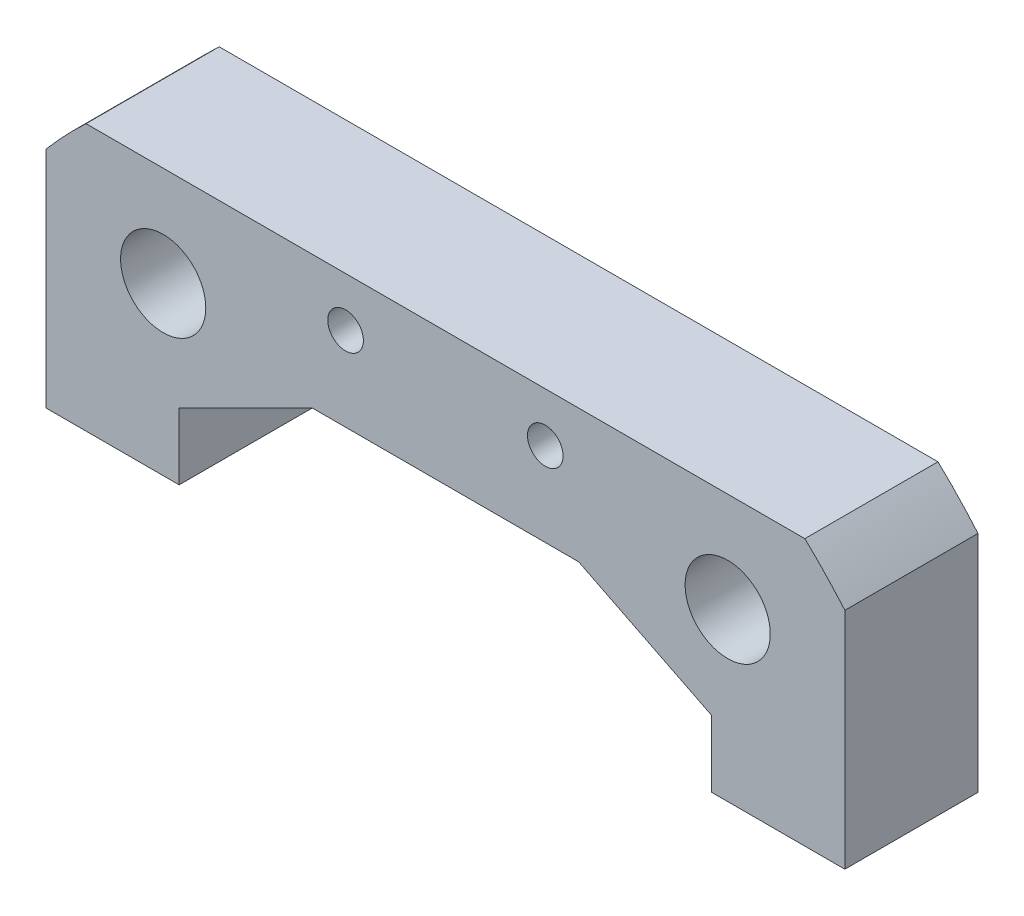
ISO-10303-21;
HEADER;
FILE_DESCRIPTION(('STEP AP214'),'2;1');
FILE_NAME('part.step','',(''),(''),'','','');
FILE_SCHEMA(('AUTOMOTIVE_DESIGN { 1 0 10303 214 1 1 1 1 }'));
ENDSEC;
DATA;
#1=APPLICATION_CONTEXT('core data for automotive mechanical design processes');
#2=APPLICATION_PROTOCOL_DEFINITION('international standard','automotive_design',2000,#1);
#3=PRODUCT_CONTEXT('',#1,'mechanical');
#4=PRODUCT('Part','Part','',(#3));
#5=PRODUCT_RELATED_PRODUCT_CATEGORY('part','',(#4));
#6=PRODUCT_DEFINITION_FORMATION('','',#4);
#7=PRODUCT_DEFINITION_CONTEXT('part definition',#1,'design');
#8=PRODUCT_DEFINITION('design','',#6,#7);
#9=PRODUCT_DEFINITION_SHAPE('','',#8);
#10=(LENGTH_UNIT() NAMED_UNIT(*) SI_UNIT(.MILLI.,.METRE.));
#11=(NAMED_UNIT(*) PLANE_ANGLE_UNIT() SI_UNIT($,.RADIAN.));
#12=(NAMED_UNIT(*) SI_UNIT($,.STERADIAN.) SOLID_ANGLE_UNIT());
#13=UNCERTAINTY_MEASURE_WITH_UNIT(LENGTH_MEASURE(1.E-05),#10,'distance_accuracy_value','');
#14=(GEOMETRIC_REPRESENTATION_CONTEXT(3) GLOBAL_UNCERTAINTY_ASSIGNED_CONTEXT((#13)) GLOBAL_UNIT_ASSIGNED_CONTEXT((#10,
#11,#12)) REPRESENTATION_CONTEXT('',''));
#15=CARTESIAN_POINT('',(0.,0.,0.));
#16=DIRECTION('',(0.,0.,1.));
#17=DIRECTION('',(1.,0.,0.));
#18=AXIS2_PLACEMENT_3D('',#15,#16,#17);
#19=CARTESIAN_POINT('',(0.,0.,12.7));
#20=DIRECTION('',(0.,0.,1.));
#21=DIRECTION('',(1.,0.,0.));
#22=AXIS2_PLACEMENT_3D('',#19,#20,#21);
#23=PLANE('',#22);
#24=CARTESIAN_POINT('',(0.,-36.449,12.7));
#25=DIRECTION('',(0.,0.,-1.));
#26=DIRECTION('',(1.,0.,0.));
#27=AXIS2_PLACEMENT_3D('',#24,#25,#26);
#28=CIRCLE('',#27,50.038);
#29=CARTESIAN_POINT('',(-38.1,-4.01149941811176,12.7));
#30=VERTEX_POINT('',#29);
#31=CARTESIAN_POINT('',(-34.282238010375,0.,12.7));
#32=VERTEX_POINT('',#31);
#33=EDGE_CURVE('E128',#30,#32,#28,.T.);
#34=ORIENTED_EDGE('',*,*,#33,.F.);
#35=DIRECTION('',(0.,-1.,0.));
#36=VECTOR('',#35,1.);
#37=CARTESIAN_POINT('',(-38.1,0.,12.7));
#38=LINE('',#37,#36);
#39=CARTESIAN_POINT('',(-38.1,-25.4,12.7));
#40=VERTEX_POINT('',#39);
#41=EDGE_CURVE('E202',#30,#40,#38,.T.);
#42=ORIENTED_EDGE('',*,*,#41,.T.);
#43=DIRECTION('',(1.,0.,0.));
#44=VECTOR('',#43,1.);
#45=CARTESIAN_POINT('',(-38.1,-25.4,12.7));
#46=LINE('',#45,#44);
#47=CARTESIAN_POINT('',(-25.4,-25.4,12.7));
#48=VERTEX_POINT('',#47);
#49=EDGE_CURVE('E198',#40,#48,#46,.T.);
#50=ORIENTED_EDGE('',*,*,#49,.T.);
#51=DIRECTION('',(0.,1.,0.));
#52=VECTOR('',#51,1.);
#53=CARTESIAN_POINT('',(-25.4,-25.4,12.7));
#54=LINE('',#53,#52);
#55=CARTESIAN_POINT('',(-25.4,-19.05,12.7));
#56=VERTEX_POINT('',#55);
#57=EDGE_CURVE('E178',#48,#56,#54,.T.);
#58=ORIENTED_EDGE('',*,*,#57,.T.);
#59=DIRECTION('',(0.894427190999916,0.447213595499958,0.));
#60=VECTOR('',#59,1.);
#61=CARTESIAN_POINT('',(-25.4,-19.05,12.7));
#62=LINE('',#61,#60);
#63=CARTESIAN_POINT('',(-12.7,-12.7,12.7));
#64=VERTEX_POINT('',#63);
#65=EDGE_CURVE('E197',#56,#64,#62,.T.);
#66=ORIENTED_EDGE('',*,*,#65,.T.);
#67=DIRECTION('',(1.,0.,0.));
#68=VECTOR('',#67,1.);
#69=CARTESIAN_POINT('',(-12.7,-12.7,12.7));
#70=LINE('',#69,#68);
#71=CARTESIAN_POINT('',(12.7,-12.7,12.7));
#72=VERTEX_POINT('',#71);
#73=EDGE_CURVE('E155',#64,#72,#70,.T.);
#74=ORIENTED_EDGE('',*,*,#73,.T.);
#75=DIRECTION('',(-0.894427190999916,0.447213595499958,0.));
#76=VECTOR('',#75,1.);
#77=CARTESIAN_POINT('',(25.4,-19.05,12.7));
#78=LINE('',#77,#76);
#79=CARTESIAN_POINT('',(25.4,-19.05,12.7));
#80=VERTEX_POINT('',#79);
#81=EDGE_CURVE('E218',#80,#72,#78,.T.);
#82=ORIENTED_EDGE('',*,*,#81,.F.);
#83=DIRECTION('',(0.,1.,0.));
#84=VECTOR('',#83,1.);
#85=CARTESIAN_POINT('',(25.4,-25.4,12.7));
#86=LINE('',#85,#84);
#87=CARTESIAN_POINT('',(25.4,-25.4,12.7));
#88=VERTEX_POINT('',#87);
#89=EDGE_CURVE('E232',#88,#80,#86,.T.);
#90=ORIENTED_EDGE('',*,*,#89,.F.);
#91=DIRECTION('',(-1.,0.,0.));
#92=VECTOR('',#91,1.);
#93=CARTESIAN_POINT('',(38.1,-25.4,12.7));
#94=LINE('',#93,#92);
#95=CARTESIAN_POINT('',(38.1,-25.4,12.7));
#96=VERTEX_POINT('',#95);
#97=EDGE_CURVE('E229',#96,#88,#94,.T.);
#98=ORIENTED_EDGE('',*,*,#97,.F.);
#99=DIRECTION('',(0.,-1.,0.));
#100=VECTOR('',#99,1.);
#101=CARTESIAN_POINT('',(38.1,0.,12.7));
#102=LINE('',#101,#100);
#103=CARTESIAN_POINT('',(38.1,-4.01149941811176,12.7));
#104=VERTEX_POINT('',#103);
#105=EDGE_CURVE('E215',#104,#96,#102,.T.);
#106=ORIENTED_EDGE('',*,*,#105,.F.);
#107=CARTESIAN_POINT('',(0.,-36.449,12.7));
#108=DIRECTION('',(0.,0.,-1.));
#109=DIRECTION('',(1.,0.,0.));
#110=AXIS2_PLACEMENT_3D('',#107,#108,#109);
#111=CIRCLE('',#110,50.038);
#112=CARTESIAN_POINT('',(34.282238010375,0.,12.7));
#113=VERTEX_POINT('',#112);
#114=EDGE_CURVE('E61',#113,#104,#111,.T.);
#115=ORIENTED_EDGE('',*,*,#114,.F.);
#116=DIRECTION('',(-1.,0.,0.));
#117=VECTOR('',#116,1.);
#118=CARTESIAN_POINT('',(0.,0.,12.7));
#119=LINE('',#118,#117);
#120=EDGE_CURVE('E165',#113,#32,#119,.T.);
#121=ORIENTED_EDGE('',*,*,#120,.T.);
#122=EDGE_LOOP('',(#34,#42,#50,#58,#66,#74,#82,#90,#98,#106,#115,#121));
#123=FACE_BOUND('',#122,.T.);
#124=CARTESIAN_POINT('',(9.525,-4.699,12.7));
#125=DIRECTION('',(0.,0.,1.));
#126=DIRECTION('',(1.,0.,0.));
#127=AXIS2_PLACEMENT_3D('',#124,#125,#126);
#128=CIRCLE('',#127,1.7);
#129=CARTESIAN_POINT('',(11.225,-4.699,12.7));
#130=VERTEX_POINT('',#129);
#131=EDGE_CURVE('E251',#130,#130,#128,.T.);
#132=ORIENTED_EDGE('',*,*,#131,.F.);
#133=EDGE_LOOP('',(#132));
#134=FACE_BOUND('',#133,.T.);
#135=CARTESIAN_POINT('',(-9.525,-4.699,12.7));
#136=DIRECTION('',(0.,0.,1.));
#137=DIRECTION('',(1.,0.,0.));
#138=AXIS2_PLACEMENT_3D('',#135,#136,#137);
#139=CIRCLE('',#138,1.6999966);
#140=CARTESIAN_POINT('',(-7.8250034,-4.699,12.7));
#141=VERTEX_POINT('',#140);
#142=EDGE_CURVE('E241',#141,#141,#139,.T.);
#143=ORIENTED_EDGE('',*,*,#142,.F.);
#144=EDGE_LOOP('',(#143));
#145=FACE_BOUND('',#144,.T.);
#146=CARTESIAN_POINT('',(-26.924,-9.525,12.7));
#147=DIRECTION('',(0.,0.,1.));
#148=DIRECTION('',(1.,0.,0.));
#149=AXIS2_PLACEMENT_3D('',#146,#147,#148);
#150=CIRCLE('',#149,4.064);
#151=CARTESIAN_POINT('',(-22.86,-9.525,12.7));
#152=VERTEX_POINT('',#151);
#153=EDGE_CURVE('E147',#152,#152,#150,.T.);
#154=ORIENTED_EDGE('',*,*,#153,.F.);
#155=EDGE_LOOP('',(#154));
#156=FACE_BOUND('',#155,.T.);
#157=CARTESIAN_POINT('',(26.924,-9.525,12.7));
#158=DIRECTION('',(0.,0.,-1.));
#159=DIRECTION('',(-1.,0.,0.));
#160=AXIS2_PLACEMENT_3D('',#157,#158,#159);
#161=CIRCLE('',#160,4.064);
#162=CARTESIAN_POINT('',(22.86,-9.525,12.7));
#163=VERTEX_POINT('',#162);
#164=EDGE_CURVE('E227',#163,#163,#161,.T.);
#165=ORIENTED_EDGE('',*,*,#164,.T.);
#166=EDGE_LOOP('',(#165));
#167=FACE_BOUND('',#166,.T.);
#168=ADVANCED_FACE('F38',(#123,#134,#145,#156,#167),#23,.T.);
#169=CARTESIAN_POINT('',(0.,0.,0.));
#170=DIRECTION('',(0.,0.,1.));
#171=DIRECTION('',(1.,0.,0.));
#172=AXIS2_PLACEMENT_3D('',#169,#170,#171);
#173=PLANE('',#172);
#174=CARTESIAN_POINT('',(9.525,-4.699,0.));
#175=DIRECTION('',(0.,0.,1.));
#176=DIRECTION('',(1.,0.,0.));
#177=AXIS2_PLACEMENT_3D('',#174,#175,#176);
#178=CIRCLE('',#177,1.7);
#179=CARTESIAN_POINT('',(11.225,-4.699,0.));
#180=VERTEX_POINT('',#179);
#181=EDGE_CURVE('E256',#180,#180,#178,.T.);
#182=ORIENTED_EDGE('',*,*,#181,.T.);
#183=EDGE_LOOP('',(#182));
#184=FACE_BOUND('',#183,.T.);
#185=CARTESIAN_POINT('',(-9.525,-4.699,0.));
#186=DIRECTION('',(0.,0.,1.));
#187=DIRECTION('',(1.,0.,0.));
#188=AXIS2_PLACEMENT_3D('',#185,#186,#187);
#189=CIRCLE('',#188,1.6999966);
#190=CARTESIAN_POINT('',(-7.8250034,-4.699,0.));
#191=VERTEX_POINT('',#190);
#192=EDGE_CURVE('E244',#191,#191,#189,.T.);
#193=ORIENTED_EDGE('',*,*,#192,.T.);
#194=EDGE_LOOP('',(#193));
#195=FACE_BOUND('',#194,.T.);
#196=DIRECTION('',(0.,-1.,0.));
#197=VECTOR('',#196,1.);
#198=CARTESIAN_POINT('',(-38.1,0.,0.));
#199=LINE('',#198,#197);
#200=CARTESIAN_POINT('',(-38.1,-4.01149941811176,0.));
#201=VERTEX_POINT('',#200);
#202=CARTESIAN_POINT('',(-38.1,-25.4,0.));
#203=VERTEX_POINT('',#202);
#204=EDGE_CURVE('E143',#201,#203,#199,.T.);
#205=ORIENTED_EDGE('',*,*,#204,.F.);
#206=CARTESIAN_POINT('',(0.,-36.449,0.));
#207=DIRECTION('',(0.,0.,-1.));
#208=DIRECTION('',(1.,0.,0.));
#209=AXIS2_PLACEMENT_3D('',#206,#207,#208);
#210=CIRCLE('',#209,50.038);
#211=CARTESIAN_POINT('',(-34.282238010375,0.,0.));
#212=VERTEX_POINT('',#211);
#213=EDGE_CURVE('E53',#201,#212,#210,.T.);
#214=ORIENTED_EDGE('',*,*,#213,.T.);
#215=DIRECTION('',(-1.,0.,0.));
#216=VECTOR('',#215,1.);
#217=CARTESIAN_POINT('',(0.,0.,0.));
#218=LINE('',#217,#216);
#219=CARTESIAN_POINT('',(34.282238010375,0.,0.));
#220=VERTEX_POINT('',#219);
#221=EDGE_CURVE('E141',#220,#212,#218,.T.);
#222=ORIENTED_EDGE('',*,*,#221,.F.);
#223=CARTESIAN_POINT('',(0.,-36.449,0.));
#224=DIRECTION('',(0.,0.,-1.));
#225=DIRECTION('',(1.,0.,0.));
#226=AXIS2_PLACEMENT_3D('',#223,#224,#225);
#227=CIRCLE('',#226,50.038);
#228=CARTESIAN_POINT('',(38.1,-4.01149941811176,0.));
#229=VERTEX_POINT('',#228);
#230=EDGE_CURVE('E249',#220,#229,#227,.T.);
#231=ORIENTED_EDGE('',*,*,#230,.T.);
#232=DIRECTION('',(0.,-1.,0.));
#233=VECTOR('',#232,1.);
#234=CARTESIAN_POINT('',(38.1,0.,0.));
#235=LINE('',#234,#233);
#236=CARTESIAN_POINT('',(38.1,-25.4,0.));
#237=VERTEX_POINT('',#236);
#238=EDGE_CURVE('E216',#229,#237,#235,.T.);
#239=ORIENTED_EDGE('',*,*,#238,.T.);
#240=DIRECTION('',(-1.,0.,0.));
#241=VECTOR('',#240,1.);
#242=CARTESIAN_POINT('',(38.1,-25.4,0.));
#243=LINE('',#242,#241);
#244=CARTESIAN_POINT('',(25.4,-25.4,0.));
#245=VERTEX_POINT('',#244);
#246=EDGE_CURVE('E219',#237,#245,#243,.T.);
#247=ORIENTED_EDGE('',*,*,#246,.T.);
#248=DIRECTION('',(0.,1.,0.));
#249=VECTOR('',#248,1.);
#250=CARTESIAN_POINT('',(25.4,-25.4,0.));
#251=LINE('',#250,#249);
#252=CARTESIAN_POINT('',(25.4,-19.05,0.));
#253=VERTEX_POINT('',#252);
#254=EDGE_CURVE('E222',#245,#253,#251,.T.);
#255=ORIENTED_EDGE('',*,*,#254,.T.);
#256=DIRECTION('',(-0.894427190999916,0.447213595499958,0.));
#257=VECTOR('',#256,1.);
#258=CARTESIAN_POINT('',(25.4,-19.05,0.));
#259=LINE('',#258,#257);
#260=CARTESIAN_POINT('',(12.7,-12.7,0.));
#261=VERTEX_POINT('',#260);
#262=EDGE_CURVE('E225',#253,#261,#259,.T.);
#263=ORIENTED_EDGE('',*,*,#262,.T.);
#264=DIRECTION('',(1.,0.,0.));
#265=VECTOR('',#264,1.);
#266=CARTESIAN_POINT('',(-12.7,-12.7,0.));
#267=LINE('',#266,#265);
#268=CARTESIAN_POINT('',(-12.7,-12.7,0.));
#269=VERTEX_POINT('',#268);
#270=EDGE_CURVE('E163',#269,#261,#267,.T.);
#271=ORIENTED_EDGE('',*,*,#270,.F.);
#272=DIRECTION('',(0.894427190999916,0.447213595499958,0.));
#273=VECTOR('',#272,1.);
#274=CARTESIAN_POINT('',(-25.4,-19.05,0.));
#275=LINE('',#274,#273);
#276=CARTESIAN_POINT('',(-25.4,-19.05,0.));
#277=VERTEX_POINT('',#276);
#278=EDGE_CURVE('E161',#277,#269,#275,.T.);
#279=ORIENTED_EDGE('',*,*,#278,.F.);
#280=DIRECTION('',(0.,1.,0.));
#281=VECTOR('',#280,1.);
#282=CARTESIAN_POINT('',(-25.4,-25.4,0.));
#283=LINE('',#282,#281);
#284=CARTESIAN_POINT('',(-25.4,-25.4,0.));
#285=VERTEX_POINT('',#284);
#286=EDGE_CURVE('E159',#285,#277,#283,.T.);
#287=ORIENTED_EDGE('',*,*,#286,.F.);
#288=DIRECTION('',(1.,0.,0.));
#289=VECTOR('',#288,1.);
#290=CARTESIAN_POINT('',(-38.1,-25.4,0.));
#291=LINE('',#290,#289);
#292=EDGE_CURVE('E149',#203,#285,#291,.T.);
#293=ORIENTED_EDGE('',*,*,#292,.F.);
#294=EDGE_LOOP('',(#205,#214,#222,#231,#239,#247,#255,#263,#271,#279,#287,#293));
#295=FACE_BOUND('',#294,.T.);
#296=CARTESIAN_POINT('',(-26.924,-9.525,0.));
#297=DIRECTION('',(0.,0.,1.));
#298=DIRECTION('',(1.,0.,0.));
#299=AXIS2_PLACEMENT_3D('',#296,#297,#298);
#300=CIRCLE('',#299,4.064);
#301=CARTESIAN_POINT('',(-22.86,-9.525,0.));
#302=VERTEX_POINT('',#301);
#303=EDGE_CURVE('E152',#302,#302,#300,.T.);
#304=ORIENTED_EDGE('',*,*,#303,.T.);
#305=EDGE_LOOP('',(#304));
#306=FACE_BOUND('',#305,.T.);
#307=CARTESIAN_POINT('',(26.924,-9.525,0.));
#308=DIRECTION('',(0.,0.,-1.));
#309=DIRECTION('',(-1.,0.,0.));
#310=AXIS2_PLACEMENT_3D('',#307,#308,#309);
#311=CIRCLE('',#310,4.064);
#312=CARTESIAN_POINT('',(22.86,-9.525,0.));
#313=VERTEX_POINT('',#312);
#314=EDGE_CURVE('E236',#313,#313,#311,.T.);
#315=ORIENTED_EDGE('',*,*,#314,.F.);
#316=EDGE_LOOP('',(#315));
#317=FACE_BOUND('',#316,.T.);
#318=ADVANCED_FACE('F138',(#184,#195,#295,#306,#317),#173,.F.);
#319=CARTESIAN_POINT('',(0.,0.,12.7));
#320=DIRECTION('',(0.,-1.,0.));
#321=DIRECTION('',(1.,0.,0.));
#322=AXIS2_PLACEMENT_3D('',#319,#320,#321);
#323=PLANE('',#322);
#324=ORIENTED_EDGE('',*,*,#221,.T.);
#325=DIRECTION('',(0.,0.,1.));
#326=VECTOR('',#325,1.);
#327=CARTESIAN_POINT('',(-34.282238010375,0.,0.));
#328=LINE('',#327,#326);
#329=EDGE_CURVE('E125',#212,#32,#328,.T.);
#330=ORIENTED_EDGE('',*,*,#329,.T.);
#331=ORIENTED_EDGE('',*,*,#120,.F.);
#332=DIRECTION('',(0.,0.,1.));
#333=VECTOR('',#332,1.);
#334=CARTESIAN_POINT('',(34.282238010375,0.,0.));
#335=LINE('',#334,#333);
#336=EDGE_CURVE('E146',#220,#113,#335,.T.);
#337=ORIENTED_EDGE('',*,*,#336,.F.);
#338=EDGE_LOOP('',(#324,#330,#331,#337));
#339=FACE_BOUND('',#338,.T.);
#340=ADVANCED_FACE('F40',(#339),#323,.F.);
#341=CARTESIAN_POINT('',(-38.1,0.,12.7));
#342=DIRECTION('',(1.,0.,0.));
#343=DIRECTION('',(0.,0.,-1.));
#344=AXIS2_PLACEMENT_3D('',#341,#342,#343);
#345=PLANE('',#344);
#346=ORIENTED_EDGE('',*,*,#41,.F.);
#347=DIRECTION('',(0.,0.,1.));
#348=VECTOR('',#347,1.);
#349=CARTESIAN_POINT('',(-38.1,-4.01149941811176,0.));
#350=LINE('',#349,#348);
#351=EDGE_CURVE('E133',#201,#30,#350,.T.);
#352=ORIENTED_EDGE('',*,*,#351,.F.);
#353=ORIENTED_EDGE('',*,*,#204,.T.);
#354=DIRECTION('',(0.,0.,-1.));
#355=VECTOR('',#354,1.);
#356=CARTESIAN_POINT('',(-38.1,-25.4,12.7));
#357=LINE('',#356,#355);
#358=EDGE_CURVE('E11',#40,#203,#357,.T.);
#359=ORIENTED_EDGE('',*,*,#358,.F.);
#360=EDGE_LOOP('',(#346,#352,#353,#359));
#361=FACE_BOUND('',#360,.T.);
#362=ADVANCED_FACE('F264',(#361),#345,.F.);
#363=CARTESIAN_POINT('',(-38.1,-25.4,12.7));
#364=DIRECTION('',(0.,1.,0.));
#365=DIRECTION('',(-1.,0.,0.));
#366=AXIS2_PLACEMENT_3D('',#363,#364,#365);
#367=PLANE('',#366);
#368=ORIENTED_EDGE('',*,*,#292,.T.);
#369=DIRECTION('',(0.,0.,-1.));
#370=VECTOR('',#369,1.);
#371=CARTESIAN_POINT('',(-25.4,-25.4,12.7));
#372=LINE('',#371,#370);
#373=EDGE_CURVE('E46',#48,#285,#372,.T.);
#374=ORIENTED_EDGE('',*,*,#373,.F.);
#375=ORIENTED_EDGE('',*,*,#49,.F.);
#376=ORIENTED_EDGE('',*,*,#358,.T.);
#377=EDGE_LOOP('',(#368,#374,#375,#376));
#378=FACE_BOUND('',#377,.T.);
#379=ADVANCED_FACE('F265',(#378),#367,.F.);
#380=CARTESIAN_POINT('',(-25.4,-25.4,12.7));
#381=DIRECTION('',(-1.,0.,0.));
#382=DIRECTION('',(0.,0.,1.));
#383=AXIS2_PLACEMENT_3D('',#380,#381,#382);
#384=PLANE('',#383);
#385=ORIENTED_EDGE('',*,*,#286,.T.);
#386=DIRECTION('',(0.,0.,-1.));
#387=VECTOR('',#386,1.);
#388=CARTESIAN_POINT('',(-25.4,-19.05,12.7));
#389=LINE('',#388,#387);
#390=EDGE_CURVE('E169',#56,#277,#389,.T.);
#391=ORIENTED_EDGE('',*,*,#390,.F.);
#392=ORIENTED_EDGE('',*,*,#57,.F.);
#393=ORIENTED_EDGE('',*,*,#373,.T.);
#394=EDGE_LOOP('',(#385,#391,#392,#393));
#395=FACE_BOUND('',#394,.T.);
#396=ADVANCED_FACE('F176',(#395),#384,.F.);
#397=CARTESIAN_POINT('',(-25.4,-19.05,12.7));
#398=DIRECTION('',(-0.447213595499958,0.894427190999916,0.));
#399=DIRECTION('',(-0.894427190999916,-0.447213595499958,0.));
#400=AXIS2_PLACEMENT_3D('',#397,#398,#399);
#401=PLANE('',#400);
#402=ORIENTED_EDGE('',*,*,#278,.T.);
#403=DIRECTION('',(0.,0.,-1.));
#404=VECTOR('',#403,1.);
#405=CARTESIAN_POINT('',(-12.7,-12.7,12.7));
#406=LINE('',#405,#404);
#407=EDGE_CURVE('E166',#64,#269,#406,.T.);
#408=ORIENTED_EDGE('',*,*,#407,.F.);
#409=ORIENTED_EDGE('',*,*,#65,.F.);
#410=ORIENTED_EDGE('',*,*,#390,.T.);
#411=EDGE_LOOP('',(#402,#408,#409,#410));
#412=FACE_BOUND('',#411,.T.);
#413=ADVANCED_FACE('F186',(#412),#401,.F.);
#414=CARTESIAN_POINT('',(-12.7,-12.7,12.7));
#415=DIRECTION('',(0.,1.,0.));
#416=DIRECTION('',(0.,0.,1.));
#417=AXIS2_PLACEMENT_3D('',#414,#415,#416);
#418=PLANE('',#417);
#419=ORIENTED_EDGE('',*,*,#270,.T.);
#420=DIRECTION('',(0.,0.,-1.));
#421=VECTOR('',#420,1.);
#422=CARTESIAN_POINT('',(12.7,-12.7,12.7));
#423=LINE('',#422,#421);
#424=EDGE_CURVE('E193',#72,#261,#423,.T.);
#425=ORIENTED_EDGE('',*,*,#424,.F.);
#426=ORIENTED_EDGE('',*,*,#73,.F.);
#427=ORIENTED_EDGE('',*,*,#407,.T.);
#428=EDGE_LOOP('',(#419,#425,#426,#427));
#429=FACE_BOUND('',#428,.T.);
#430=ADVANCED_FACE('F190',(#429),#418,.F.);
#431=CARTESIAN_POINT('',(-26.924,-9.525,12.7));
#432=DIRECTION('',(0.,0.,-1.));
#433=DIRECTION('',(-1.,0.,0.));
#434=AXIS2_PLACEMENT_3D('',#431,#432,#433);
#435=CYLINDRICAL_SURFACE('',#434,4.064);
#436=ORIENTED_EDGE('',*,*,#153,.T.);
#437=EDGE_LOOP('',(#436));
#438=FACE_BOUND('',#437,.T.);
#439=ORIENTED_EDGE('',*,*,#303,.F.);
#440=EDGE_LOOP('',(#439));
#441=FACE_BOUND('',#440,.T.);
#442=ADVANCED_FACE('F281',(#438,#441),#435,.F.);
#443=CARTESIAN_POINT('',(25.4,-19.05,12.7));
#444=DIRECTION('',(-0.447213595499958,-0.894427190999916,0.));
#445=DIRECTION('',(0.894427190999916,-0.447213595499958,0.));
#446=AXIS2_PLACEMENT_3D('',#443,#444,#445);
#447=PLANE('',#446);
#448=ORIENTED_EDGE('',*,*,#262,.F.);
#449=DIRECTION('',(0.,0.,-1.));
#450=VECTOR('',#449,1.);
#451=CARTESIAN_POINT('',(25.4,-19.05,12.7));
#452=LINE('',#451,#450);
#453=EDGE_CURVE('E208',#80,#253,#452,.T.);
#454=ORIENTED_EDGE('',*,*,#453,.F.);
#455=ORIENTED_EDGE('',*,*,#81,.T.);
#456=ORIENTED_EDGE('',*,*,#424,.T.);
#457=EDGE_LOOP('',(#448,#454,#455,#456));
#458=FACE_BOUND('',#457,.T.);
#459=ADVANCED_FACE('F302',(#458),#447,.T.);
#460=CARTESIAN_POINT('',(25.4,-25.4,12.7));
#461=DIRECTION('',(-1.,0.,0.));
#462=DIRECTION('',(0.,0.,1.));
#463=AXIS2_PLACEMENT_3D('',#460,#461,#462);
#464=PLANE('',#463);
#465=ORIENTED_EDGE('',*,*,#254,.F.);
#466=DIRECTION('',(0.,0.,-1.));
#467=VECTOR('',#466,1.);
#468=CARTESIAN_POINT('',(25.4,-25.4,12.7));
#469=LINE('',#468,#467);
#470=EDGE_CURVE('E210',#88,#245,#469,.T.);
#471=ORIENTED_EDGE('',*,*,#470,.F.);
#472=ORIENTED_EDGE('',*,*,#89,.T.);
#473=ORIENTED_EDGE('',*,*,#453,.T.);
#474=EDGE_LOOP('',(#465,#471,#472,#473));
#475=FACE_BOUND('',#474,.T.);
#476=ADVANCED_FACE('F308',(#475),#464,.T.);
#477=CARTESIAN_POINT('',(38.1,-25.4,12.7));
#478=DIRECTION('',(0.,-1.,0.));
#479=DIRECTION('',(1.,0.,0.));
#480=AXIS2_PLACEMENT_3D('',#477,#478,#479);
#481=PLANE('',#480);
#482=ORIENTED_EDGE('',*,*,#246,.F.);
#483=DIRECTION('',(0.,0.,-1.));
#484=VECTOR('',#483,1.);
#485=CARTESIAN_POINT('',(38.1,-25.4,12.7));
#486=LINE('',#485,#484);
#487=EDGE_CURVE('E212',#96,#237,#486,.T.);
#488=ORIENTED_EDGE('',*,*,#487,.F.);
#489=ORIENTED_EDGE('',*,*,#97,.T.);
#490=ORIENTED_EDGE('',*,*,#470,.T.);
#491=EDGE_LOOP('',(#482,#488,#489,#490));
#492=FACE_BOUND('',#491,.T.);
#493=ADVANCED_FACE('F315',(#492),#481,.T.);
#494=CARTESIAN_POINT('',(38.1,0.,12.7));
#495=DIRECTION('',(1.,0.,0.));
#496=DIRECTION('',(0.,0.,-1.));
#497=AXIS2_PLACEMENT_3D('',#494,#495,#496);
#498=PLANE('',#497);
#499=DIRECTION('',(0.,0.,1.));
#500=VECTOR('',#499,1.);
#501=CARTESIAN_POINT('',(38.1,-4.01149941811176,0.));
#502=LINE('',#501,#500);
#503=EDGE_CURVE('E247',#229,#104,#502,.T.);
#504=ORIENTED_EDGE('',*,*,#503,.T.);
#505=ORIENTED_EDGE('',*,*,#105,.T.);
#506=ORIENTED_EDGE('',*,*,#487,.T.);
#507=ORIENTED_EDGE('',*,*,#238,.F.);
#508=EDGE_LOOP('',(#504,#505,#506,#507));
#509=FACE_BOUND('',#508,.T.);
#510=ADVANCED_FACE('F323',(#509),#498,.T.);
#511=CARTESIAN_POINT('',(26.924,-9.525,12.7));
#512=DIRECTION('',(0.,0.,-1.));
#513=DIRECTION('',(-1.,0.,0.));
#514=AXIS2_PLACEMENT_3D('',#511,#512,#513);
#515=CYLINDRICAL_SURFACE('',#514,4.064);
#516=ORIENTED_EDGE('',*,*,#164,.F.);
#517=EDGE_LOOP('',(#516));
#518=FACE_BOUND('',#517,.T.);
#519=ORIENTED_EDGE('',*,*,#314,.T.);
#520=EDGE_LOOP('',(#519));
#521=FACE_BOUND('',#520,.T.);
#522=ADVANCED_FACE('F332',(#518,#521),#515,.F.);
#523=CARTESIAN_POINT('',(0.,-36.449,0.));
#524=DIRECTION('',(0.,0.,1.));
#525=DIRECTION('',(1.,0.,0.));
#526=AXIS2_PLACEMENT_3D('',#523,#524,#525);
#527=CYLINDRICAL_SURFACE('',#526,50.038);
#528=ORIENTED_EDGE('',*,*,#114,.T.);
#529=ORIENTED_EDGE('',*,*,#503,.F.);
#530=ORIENTED_EDGE('',*,*,#230,.F.);
#531=ORIENTED_EDGE('',*,*,#336,.T.);
#532=EDGE_LOOP('',(#528,#529,#530,#531));
#533=FACE_BOUND('',#532,.T.);
#534=ADVANCED_FACE('F341',(#533),#527,.T.);
#535=CARTESIAN_POINT('',(0.,-36.449,0.));
#536=DIRECTION('',(0.,0.,1.));
#537=DIRECTION('',(1.,0.,0.));
#538=AXIS2_PLACEMENT_3D('',#535,#536,#537);
#539=CYLINDRICAL_SURFACE('',#538,50.038);
#540=ORIENTED_EDGE('',*,*,#33,.T.);
#541=ORIENTED_EDGE('',*,*,#329,.F.);
#542=ORIENTED_EDGE('',*,*,#213,.F.);
#543=ORIENTED_EDGE('',*,*,#351,.T.);
#544=EDGE_LOOP('',(#540,#541,#542,#543));
#545=FACE_BOUND('',#544,.T.);
#546=ADVANCED_FACE('F126',(#545),#539,.T.);
#547=CARTESIAN_POINT('',(-9.525,-4.699,0.));
#548=DIRECTION('',(0.,0.,1.));
#549=DIRECTION('',(1.,0.,0.));
#550=AXIS2_PLACEMENT_3D('',#547,#548,#549);
#551=CYLINDRICAL_SURFACE('',#550,1.6999966);
#552=ORIENTED_EDGE('',*,*,#192,.F.);
#553=EDGE_LOOP('',(#552));
#554=FACE_BOUND('',#553,.T.);
#555=ORIENTED_EDGE('',*,*,#142,.T.);
#556=EDGE_LOOP('',(#555));
#557=FACE_BOUND('',#556,.T.);
#558=ADVANCED_FACE('F354',(#554,#557),#551,.F.);
#559=CARTESIAN_POINT('',(9.525,-4.699,0.));
#560=DIRECTION('',(0.,0.,1.));
#561=DIRECTION('',(1.,0.,0.));
#562=AXIS2_PLACEMENT_3D('',#559,#560,#561);
#563=CYLINDRICAL_SURFACE('',#562,1.7);
#564=ORIENTED_EDGE('',*,*,#181,.F.);
#565=EDGE_LOOP('',(#564));
#566=FACE_BOUND('',#565,.T.);
#567=ORIENTED_EDGE('',*,*,#131,.T.);
#568=EDGE_LOOP('',(#567));
#569=FACE_BOUND('',#568,.T.);
#570=ADVANCED_FACE('F361',(#566,#569),#563,.F.);
#571=CLOSED_SHELL('',(#168,#318,#340,#362,#379,#396,#413,#430,#442,#459,#476,#493,#510,#522,
#534,#546,#558,#570));
#572=MANIFOLD_SOLID_BREP('B2',#571);
#573=ADVANCED_BREP_SHAPE_REPRESENTATION('',(#18,#572),#14);
#574=SHAPE_DEFINITION_REPRESENTATION(#9,#573);
ENDSEC;
END-ISO-10303-21;
